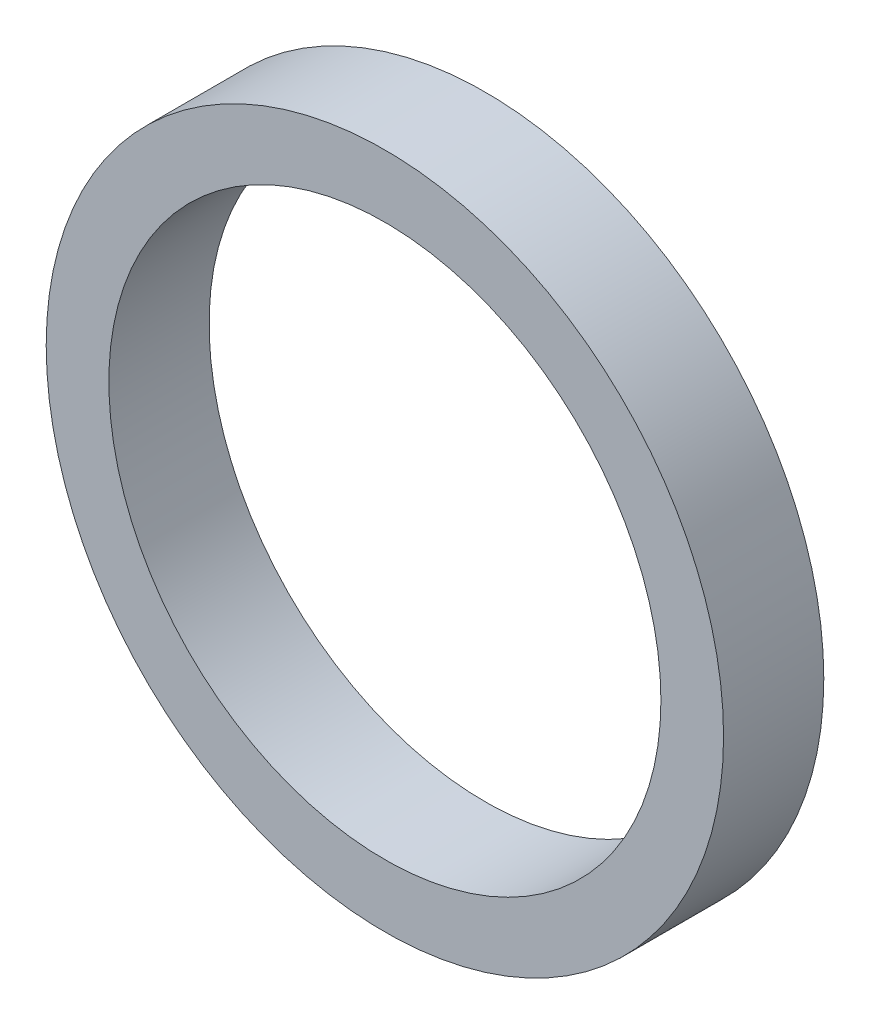
ISO-10303-21;
HEADER;
FILE_DESCRIPTION(('STEP AP214'),'2;1');
FILE_NAME('part.step','',(''),(''),'','','');
FILE_SCHEMA(('AUTOMOTIVE_DESIGN { 1 0 10303 214 1 1 1 1 }'));
ENDSEC;
DATA;
#1=APPLICATION_CONTEXT('core data for automotive mechanical design processes');
#2=APPLICATION_PROTOCOL_DEFINITION('international standard','automotive_design',2000,#1);
#3=PRODUCT_CONTEXT('',#1,'mechanical');
#4=PRODUCT('Part','Part','',(#3));
#5=PRODUCT_RELATED_PRODUCT_CATEGORY('part','',(#4));
#6=PRODUCT_DEFINITION_FORMATION('','',#4);
#7=PRODUCT_DEFINITION_CONTEXT('part definition',#1,'design');
#8=PRODUCT_DEFINITION('design','',#6,#7);
#9=PRODUCT_DEFINITION_SHAPE('','',#8);
#10=(LENGTH_UNIT() NAMED_UNIT(*) SI_UNIT(.MILLI.,.METRE.));
#11=(NAMED_UNIT(*) PLANE_ANGLE_UNIT() SI_UNIT($,.RADIAN.));
#12=(NAMED_UNIT(*) SI_UNIT($,.STERADIAN.) SOLID_ANGLE_UNIT());
#13=UNCERTAINTY_MEASURE_WITH_UNIT(LENGTH_MEASURE(1.E-05),#10,'distance_accuracy_value','');
#14=(GEOMETRIC_REPRESENTATION_CONTEXT(3) GLOBAL_UNCERTAINTY_ASSIGNED_CONTEXT((#13)) GLOBAL_UNIT_ASSIGNED_CONTEXT((#10,
#11,#12)) REPRESENTATION_CONTEXT('',''));
#15=CARTESIAN_POINT('',(0.,0.,0.));
#16=DIRECTION('',(0.,0.,1.));
#17=DIRECTION('',(1.,0.,0.));
#18=AXIS2_PLACEMENT_3D('',#15,#16,#17);
#19=CARTESIAN_POINT('',(0.,0.,4.));
#20=DIRECTION('',(0.,0.,1.));
#21=DIRECTION('',(1.,0.,0.));
#22=AXIS2_PLACEMENT_3D('',#19,#20,#21);
#23=PLANE('',#22);
#24=CARTESIAN_POINT('',(0.,0.,4.));
#25=DIRECTION('',(0.,0.,1.));
#26=DIRECTION('',(1.,0.,0.));
#27=AXIS2_PLACEMENT_3D('',#24,#25,#26);
#28=CIRCLE('',#27,13.515);
#29=CARTESIAN_POINT('',(13.515,0.,4.));
#30=VERTEX_POINT('',#29);
#31=EDGE_CURVE('E10',#30,#30,#28,.T.);
#32=ORIENTED_EDGE('',*,*,#31,.T.);
#33=EDGE_LOOP('',(#32));
#34=FACE_BOUND('',#33,.T.);
#35=CARTESIAN_POINT('',(0.,0.,4.));
#36=DIRECTION('',(0.,0.,1.));
#37=DIRECTION('',(1.,0.,0.));
#38=AXIS2_PLACEMENT_3D('',#35,#36,#37);
#39=CIRCLE('',#38,11.015);
#40=CARTESIAN_POINT('',(11.015,0.,4.));
#41=VERTEX_POINT('',#40);
#42=EDGE_CURVE('E46',#41,#41,#39,.T.);
#43=ORIENTED_EDGE('',*,*,#42,.F.);
#44=EDGE_LOOP('',(#43));
#45=FACE_BOUND('',#44,.T.);
#46=ADVANCED_FACE('F35',(#34,#45),#23,.T.);
#47=CARTESIAN_POINT('',(0.,0.,0.));
#48=DIRECTION('',(0.,0.,1.));
#49=DIRECTION('',(1.,0.,0.));
#50=AXIS2_PLACEMENT_3D('',#47,#48,#49);
#51=PLANE('',#50);
#52=CARTESIAN_POINT('',(0.,0.,0.));
#53=DIRECTION('',(0.,0.,1.));
#54=DIRECTION('',(1.,0.,0.));
#55=AXIS2_PLACEMENT_3D('',#52,#53,#54);
#56=CIRCLE('',#55,13.515);
#57=CARTESIAN_POINT('',(13.515,0.,0.));
#58=VERTEX_POINT('',#57);
#59=EDGE_CURVE('E39',#58,#58,#56,.T.);
#60=ORIENTED_EDGE('',*,*,#59,.F.);
#61=EDGE_LOOP('',(#60));
#62=FACE_BOUND('',#61,.T.);
#63=CARTESIAN_POINT('',(0.,0.,0.));
#64=DIRECTION('',(0.,0.,1.));
#65=DIRECTION('',(1.,0.,0.));
#66=AXIS2_PLACEMENT_3D('',#63,#64,#65);
#67=CIRCLE('',#66,11.015);
#68=CARTESIAN_POINT('',(11.015,0.,0.));
#69=VERTEX_POINT('',#68);
#70=EDGE_CURVE('E48',#69,#69,#67,.T.);
#71=ORIENTED_EDGE('',*,*,#70,.T.);
#72=EDGE_LOOP('',(#71));
#73=FACE_BOUND('',#72,.T.);
#74=ADVANCED_FACE('F58',(#62,#73),#51,.F.);
#75=CARTESIAN_POINT('',(0.,0.,4.));
#76=DIRECTION('',(0.,0.,-1.));
#77=DIRECTION('',(-1.,0.,0.));
#78=AXIS2_PLACEMENT_3D('',#75,#76,#77);
#79=CYLINDRICAL_SURFACE('',#78,13.515);
#80=ORIENTED_EDGE('',*,*,#31,.F.);
#81=EDGE_LOOP('',(#80));
#82=FACE_BOUND('',#81,.T.);
#83=ORIENTED_EDGE('',*,*,#59,.T.);
#84=EDGE_LOOP('',(#83));
#85=FACE_BOUND('',#84,.T.);
#86=ADVANCED_FACE('F37',(#82,#85),#79,.T.);
#87=CARTESIAN_POINT('',(0.,0.,4.));
#88=DIRECTION('',(0.,0.,-1.));
#89=DIRECTION('',(-1.,0.,0.));
#90=AXIS2_PLACEMENT_3D('',#87,#88,#89);
#91=CYLINDRICAL_SURFACE('',#90,11.015);
#92=ORIENTED_EDGE('',*,*,#42,.T.);
#93=EDGE_LOOP('',(#92));
#94=FACE_BOUND('',#93,.T.);
#95=ORIENTED_EDGE('',*,*,#70,.F.);
#96=EDGE_LOOP('',(#95));
#97=FACE_BOUND('',#96,.T.);
#98=ADVANCED_FACE('F54',(#94,#97),#91,.F.);
#99=CLOSED_SHELL('',(#46,#74,#86,#98));
#100=MANIFOLD_SOLID_BREP('B2',#99);
#101=ADVANCED_BREP_SHAPE_REPRESENTATION('',(#18,#100),#14);
#102=SHAPE_DEFINITION_REPRESENTATION(#9,#101);
ENDSEC;
END-ISO-10303-21;
